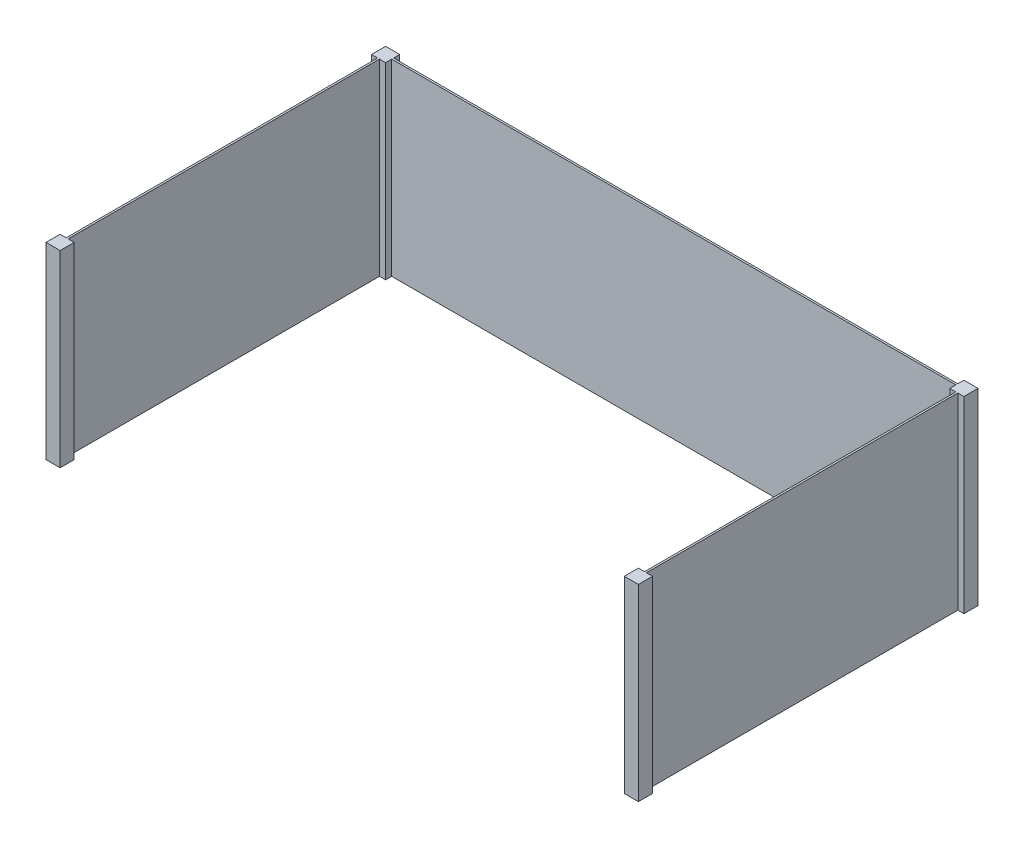
ISO-10303-21;
HEADER;
FILE_DESCRIPTION(('STEP AP214'),'2;1');
FILE_NAME('part.step','',(''),(''),'','','');
FILE_SCHEMA(('AUTOMOTIVE_DESIGN { 1 0 10303 214 1 1 1 1 }'));
ENDSEC;
DATA;
#1=APPLICATION_CONTEXT('core data for automotive mechanical design processes');
#2=APPLICATION_PROTOCOL_DEFINITION('international standard','automotive_design',2000,#1);
#3=PRODUCT_CONTEXT('',#1,'mechanical');
#4=PRODUCT('Part','Part','',(#3));
#5=PRODUCT_RELATED_PRODUCT_CATEGORY('part','',(#4));
#6=PRODUCT_DEFINITION_FORMATION('','',#4);
#7=PRODUCT_DEFINITION_CONTEXT('part definition',#1,'design');
#8=PRODUCT_DEFINITION('design','',#6,#7);
#9=PRODUCT_DEFINITION_SHAPE('','',#8);
#10=(LENGTH_UNIT() NAMED_UNIT(*) SI_UNIT(.MILLI.,.METRE.));
#11=(NAMED_UNIT(*) PLANE_ANGLE_UNIT() SI_UNIT($,.RADIAN.));
#12=(NAMED_UNIT(*) SI_UNIT($,.STERADIAN.) SOLID_ANGLE_UNIT());
#13=UNCERTAINTY_MEASURE_WITH_UNIT(LENGTH_MEASURE(1.E-05),#10,'distance_accuracy_value','');
#14=(GEOMETRIC_REPRESENTATION_CONTEXT(3) GLOBAL_UNCERTAINTY_ASSIGNED_CONTEXT((#13)) GLOBAL_UNIT_ASSIGNED_CONTEXT((#10,
#11,#12)) REPRESENTATION_CONTEXT('',''));
#15=CARTESIAN_POINT('',(0.,0.,0.));
#16=DIRECTION('',(0.,0.,1.));
#17=DIRECTION('',(1.,0.,0.));
#18=AXIS2_PLACEMENT_3D('',#15,#16,#17);
#19=CARTESIAN_POINT('',(37.5000000000001,1000.,5.));
#20=DIRECTION('',(-1.,0.,0.));
#21=DIRECTION('',(0.,0.,1.));
#22=AXIS2_PLACEMENT_3D('',#19,#20,#21);
#23=PLANE('',#22);
#24=DIRECTION('',(0.,0.,-1.));
#25=VECTOR('',#24,1.);
#26=CARTESIAN_POINT('',(37.5000000000001,0.,5.));
#27=LINE('',#26,#25);
#28=CARTESIAN_POINT('',(37.5,0.,37.5));
#29=VERTEX_POINT('',#28);
#30=CARTESIAN_POINT('',(37.5000000000001,0.,5.));
#31=VERTEX_POINT('',#30);
#32=EDGE_CURVE('E249',#29,#31,#27,.T.);
#33=ORIENTED_EDGE('',*,*,#32,.T.);
#34=DIRECTION('',(0.,-1.,0.));
#35=VECTOR('',#34,1.);
#36=CARTESIAN_POINT('',(37.5000000000001,1000.,5.));
#37=LINE('',#36,#35);
#38=CARTESIAN_POINT('',(37.5000000000001,1000.,5.));
#39=VERTEX_POINT('',#38);
#40=EDGE_CURVE('E11',#39,#31,#37,.T.);
#41=ORIENTED_EDGE('',*,*,#40,.F.);
#42=DIRECTION('',(0.,0.,-1.));
#43=VECTOR('',#42,1.);
#44=CARTESIAN_POINT('',(37.5000000000001,1000.,5.));
#45=LINE('',#44,#43);
#46=CARTESIAN_POINT('',(37.5,1000.,37.5));
#47=VERTEX_POINT('',#46);
#48=EDGE_CURVE('E303',#47,#39,#45,.T.);
#49=ORIENTED_EDGE('',*,*,#48,.F.);
#50=DIRECTION('',(0.,-1.,0.));
#51=VECTOR('',#50,1.);
#52=CARTESIAN_POINT('',(37.5,1000.,37.5));
#53=LINE('',#52,#51);
#54=EDGE_CURVE('E245',#47,#29,#53,.T.);
#55=ORIENTED_EDGE('',*,*,#54,.T.);
#56=EDGE_LOOP('',(#33,#41,#49,#55));
#57=FACE_BOUND('',#56,.T.);
#58=ADVANCED_FACE('F33',(#57),#23,.F.);
#59=CARTESIAN_POINT('',(3035.9725355,1000.,4.99999999999963));
#60=DIRECTION('',(0.,0.,-1.));
#61=DIRECTION('',(-1.,0.,0.));
#62=AXIS2_PLACEMENT_3D('',#59,#60,#61);
#63=PLANE('',#62);
#64=DIRECTION('',(1.,0.,0.));
#65=VECTOR('',#64,1.);
#66=CARTESIAN_POINT('',(3035.9725355,0.,4.99999999999963));
#67=LINE('',#66,#65);
#68=CARTESIAN_POINT('',(3035.9725355,0.,4.99999999999963));
#69=VERTEX_POINT('',#68);
#70=EDGE_CURVE('E252',#31,#69,#67,.T.);
#71=ORIENTED_EDGE('',*,*,#70,.T.);
#72=DIRECTION('',(0.,-1.,0.));
#73=VECTOR('',#72,1.);
#74=CARTESIAN_POINT('',(3035.9725355,1000.,4.99999999999963));
#75=LINE('',#74,#73);
#76=CARTESIAN_POINT('',(3035.9725355,1000.,4.99999999999963));
#77=VERTEX_POINT('',#76);
#78=EDGE_CURVE('E41',#77,#69,#75,.T.);
#79=ORIENTED_EDGE('',*,*,#78,.F.);
#80=DIRECTION('',(1.,0.,0.));
#81=VECTOR('',#80,1.);
#82=CARTESIAN_POINT('',(3035.9725355,1000.,4.99999999999963));
#83=LINE('',#82,#81);
#84=EDGE_CURVE('E152',#39,#77,#83,.T.);
#85=ORIENTED_EDGE('',*,*,#84,.F.);
#86=ORIENTED_EDGE('',*,*,#40,.T.);
#87=EDGE_LOOP('',(#71,#79,#85,#86));
#88=FACE_BOUND('',#87,.T.);
#89=ADVANCED_FACE('F461',(#88),#63,.F.);
#90=CARTESIAN_POINT('',(3035.9725355,1000.,4.99999999999963));
#91=DIRECTION('',(1.,0.,0.));
#92=DIRECTION('',(0.,0.,-1.));
#93=AXIS2_PLACEMENT_3D('',#90,#91,#92);
#94=PLANE('',#93);
#95=DIRECTION('',(0.,0.,1.));
#96=VECTOR('',#95,1.);
#97=CARTESIAN_POINT('',(3035.9725355,0.,4.99999999999963));
#98=LINE('',#97,#96);
#99=CARTESIAN_POINT('',(3035.9725355,0.,37.5));
#100=VERTEX_POINT('',#99);
#101=EDGE_CURVE('E254',#69,#100,#98,.T.);
#102=ORIENTED_EDGE('',*,*,#101,.T.);
#103=DIRECTION('',(0.,-1.,0.));
#104=VECTOR('',#103,1.);
#105=CARTESIAN_POINT('',(3035.9725355,1000.,37.5));
#106=LINE('',#105,#104);
#107=CARTESIAN_POINT('',(3035.9725355,1000.,37.5));
#108=VERTEX_POINT('',#107);
#109=EDGE_CURVE('E370',#108,#100,#106,.T.);
#110=ORIENTED_EDGE('',*,*,#109,.F.);
#111=DIRECTION('',(0.,0.,1.));
#112=VECTOR('',#111,1.);
#113=CARTESIAN_POINT('',(3035.9725355,1000.,4.99999999999963));
#114=LINE('',#113,#112);
#115=EDGE_CURVE('E378',#77,#108,#114,.T.);
#116=ORIENTED_EDGE('',*,*,#115,.F.);
#117=ORIENTED_EDGE('',*,*,#78,.T.);
#118=EDGE_LOOP('',(#102,#110,#116,#117));
#119=FACE_BOUND('',#118,.T.);
#120=ADVANCED_FACE('F376',(#119),#94,.F.);
#121=CARTESIAN_POINT('',(3035.9725355,1000.,37.5));
#122=DIRECTION('',(0.,0.,-1.));
#123=DIRECTION('',(-1.,0.,0.));
#124=AXIS2_PLACEMENT_3D('',#121,#122,#123);
#125=PLANE('',#124);
#126=DIRECTION('',(1.,0.,0.));
#127=VECTOR('',#126,1.);
#128=CARTESIAN_POINT('',(3035.9725355,0.,37.5));
#129=LINE('',#128,#127);
#130=CARTESIAN_POINT('',(3068.4725355,0.,37.5000000000001));
#131=VERTEX_POINT('',#130);
#132=EDGE_CURVE('E256',#100,#131,#129,.T.);
#133=ORIENTED_EDGE('',*,*,#132,.T.);
#134=DIRECTION('',(0.,-1.,0.));
#135=VECTOR('',#134,1.);
#136=CARTESIAN_POINT('',(3068.4725355,1000.,37.5000000000001));
#137=LINE('',#136,#135);
#138=CARTESIAN_POINT('',(3068.4725355,1000.,37.5000000000001));
#139=VERTEX_POINT('',#138);
#140=EDGE_CURVE('E367',#139,#131,#137,.T.);
#141=ORIENTED_EDGE('',*,*,#140,.F.);
#142=DIRECTION('',(1.,0.,0.));
#143=VECTOR('',#142,1.);
#144=CARTESIAN_POINT('',(3035.9725355,1000.,37.5));
#145=LINE('',#144,#143);
#146=EDGE_CURVE('E396',#108,#139,#145,.T.);
#147=ORIENTED_EDGE('',*,*,#146,.F.);
#148=ORIENTED_EDGE('',*,*,#109,.T.);
#149=EDGE_LOOP('',(#133,#141,#147,#148));
#150=FACE_BOUND('',#149,.T.);
#151=ADVANCED_FACE('F387',(#150),#125,.F.);
#152=CARTESIAN_POINT('',(3068.4725355,1000.,1692.39399355666));
#153=DIRECTION('',(1.,0.,0.));
#154=DIRECTION('',(0.,0.,-1.));
#155=AXIS2_PLACEMENT_3D('',#152,#153,#154);
#156=PLANE('',#155);
#157=DIRECTION('',(0.,0.,1.));
#158=VECTOR('',#157,1.);
#159=CARTESIAN_POINT('',(3068.4725355,0.,1692.39399355666));
#160=LINE('',#159,#158);
#161=CARTESIAN_POINT('',(3068.4725355,0.,1692.39399355666));
#162=VERTEX_POINT('',#161);
#163=EDGE_CURVE('E258',#131,#162,#160,.T.);
#164=ORIENTED_EDGE('',*,*,#163,.T.);
#165=DIRECTION('',(0.,-1.,0.));
#166=VECTOR('',#165,1.);
#167=CARTESIAN_POINT('',(3068.4725355,1000.,1692.39399355666));
#168=LINE('',#167,#166);
#169=CARTESIAN_POINT('',(3068.4725355,1000.,1692.39399355666));
#170=VERTEX_POINT('',#169);
#171=EDGE_CURVE('E364',#170,#162,#168,.T.);
#172=ORIENTED_EDGE('',*,*,#171,.F.);
#173=DIRECTION('',(0.,0.,1.));
#174=VECTOR('',#173,1.);
#175=CARTESIAN_POINT('',(3068.4725355,1000.,1692.39399355666));
#176=LINE('',#175,#174);
#177=EDGE_CURVE('E393',#139,#170,#176,.T.);
#178=ORIENTED_EDGE('',*,*,#177,.F.);
#179=ORIENTED_EDGE('',*,*,#140,.T.);
#180=EDGE_LOOP('',(#164,#172,#178,#179));
#181=FACE_BOUND('',#180,.T.);
#182=ADVANCED_FACE('F391',(#181),#156,.F.);
#183=CARTESIAN_POINT('',(3035.9725355,1000.,1692.39399355666));
#184=DIRECTION('',(0.,0.,1.));
#185=DIRECTION('',(1.,0.,0.));
#186=AXIS2_PLACEMENT_3D('',#183,#184,#185);
#187=PLANE('',#186);
#188=DIRECTION('',(-1.,0.,0.));
#189=VECTOR('',#188,1.);
#190=CARTESIAN_POINT('',(3035.9725355,0.,1692.39399355666));
#191=LINE('',#190,#189);
#192=CARTESIAN_POINT('',(3035.9725355,0.,1692.39399355666));
#193=VERTEX_POINT('',#192);
#194=EDGE_CURVE('E260',#162,#193,#191,.T.);
#195=ORIENTED_EDGE('',*,*,#194,.T.);
#196=DIRECTION('',(0.,-1.,0.));
#197=VECTOR('',#196,1.);
#198=CARTESIAN_POINT('',(3035.9725355,1000.,1692.39399355666));
#199=LINE('',#198,#197);
#200=CARTESIAN_POINT('',(3035.9725355,1000.,1692.39399355666));
#201=VERTEX_POINT('',#200);
#202=EDGE_CURVE('E361',#201,#193,#199,.T.);
#203=ORIENTED_EDGE('',*,*,#202,.F.);
#204=DIRECTION('',(-1.,0.,0.));
#205=VECTOR('',#204,1.);
#206=CARTESIAN_POINT('',(3035.9725355,1000.,1692.39399355666));
#207=LINE('',#206,#205);
#208=EDGE_CURVE('E395',#170,#201,#207,.T.);
#209=ORIENTED_EDGE('',*,*,#208,.F.);
#210=ORIENTED_EDGE('',*,*,#171,.T.);
#211=EDGE_LOOP('',(#195,#203,#209,#210));
#212=FACE_BOUND('',#211,.T.);
#213=ADVANCED_FACE('F474',(#212),#187,.F.);
#214=CARTESIAN_POINT('',(3035.9725355,1000.,1692.39399355666));
#215=DIRECTION('',(1.,0.,0.));
#216=DIRECTION('',(0.,0.,-1.));
#217=AXIS2_PLACEMENT_3D('',#214,#215,#216);
#218=PLANE('',#217);
#219=DIRECTION('',(0.,0.,1.));
#220=VECTOR('',#219,1.);
#221=CARTESIAN_POINT('',(3035.9725355,0.,1692.39399355666));
#222=LINE('',#221,#220);
#223=CARTESIAN_POINT('',(3035.9725355,0.,1767.39399355666));
#224=VERTEX_POINT('',#223);
#225=EDGE_CURVE('E262',#193,#224,#222,.T.);
#226=ORIENTED_EDGE('',*,*,#225,.T.);
#227=DIRECTION('',(0.,-1.,0.));
#228=VECTOR('',#227,1.);
#229=CARTESIAN_POINT('',(3035.9725355,1000.,1767.39399355666));
#230=LINE('',#229,#228);
#231=CARTESIAN_POINT('',(3035.9725355,1000.,1767.39399355666));
#232=VERTEX_POINT('',#231);
#233=EDGE_CURVE('E358',#232,#224,#230,.T.);
#234=ORIENTED_EDGE('',*,*,#233,.F.);
#235=DIRECTION('',(0.,0.,1.));
#236=VECTOR('',#235,1.);
#237=CARTESIAN_POINT('',(3035.9725355,1000.,1692.39399355666));
#238=LINE('',#237,#236);
#239=EDGE_CURVE('E398',#201,#232,#238,.T.);
#240=ORIENTED_EDGE('',*,*,#239,.F.);
#241=ORIENTED_EDGE('',*,*,#202,.T.);
#242=EDGE_LOOP('',(#226,#234,#240,#241));
#243=FACE_BOUND('',#242,.T.);
#244=ADVANCED_FACE('F477',(#243),#218,.F.);
#245=CARTESIAN_POINT('',(3035.9725355,1000.,1767.39399355666));
#246=DIRECTION('',(0.,0.,-1.));
#247=DIRECTION('',(-1.,0.,0.));
#248=AXIS2_PLACEMENT_3D('',#245,#246,#247);
#249=PLANE('',#248);
#250=DIRECTION('',(1.,0.,0.));
#251=VECTOR('',#250,1.);
#252=CARTESIAN_POINT('',(3035.9725355,0.,1767.39399355666));
#253=LINE('',#252,#251);
#254=CARTESIAN_POINT('',(3110.9725355,0.,1767.39399355666));
#255=VERTEX_POINT('',#254);
#256=EDGE_CURVE('E264',#224,#255,#253,.T.);
#257=ORIENTED_EDGE('',*,*,#256,.T.);
#258=DIRECTION('',(0.,-1.,0.));
#259=VECTOR('',#258,1.);
#260=CARTESIAN_POINT('',(3110.9725355,1000.,1767.39399355666));
#261=LINE('',#260,#259);
#262=CARTESIAN_POINT('',(3110.9725355,1000.,1767.39399355666));
#263=VERTEX_POINT('',#262);
#264=EDGE_CURVE('E355',#263,#255,#261,.T.);
#265=ORIENTED_EDGE('',*,*,#264,.F.);
#266=DIRECTION('',(1.,0.,0.));
#267=VECTOR('',#266,1.);
#268=CARTESIAN_POINT('',(3035.9725355,1000.,1767.39399355666));
#269=LINE('',#268,#267);
#270=EDGE_CURVE('E404',#232,#263,#269,.T.);
#271=ORIENTED_EDGE('',*,*,#270,.F.);
#272=ORIENTED_EDGE('',*,*,#233,.T.);
#273=EDGE_LOOP('',(#257,#265,#271,#272));
#274=FACE_BOUND('',#273,.T.);
#275=ADVANCED_FACE('F481',(#274),#249,.F.);
#276=CARTESIAN_POINT('',(3110.9725355,1000.,1692.39399355666));
#277=DIRECTION('',(-1.,0.,0.));
#278=DIRECTION('',(0.,0.,1.));
#279=AXIS2_PLACEMENT_3D('',#276,#277,#278);
#280=PLANE('',#279);
#281=DIRECTION('',(0.,0.,-1.));
#282=VECTOR('',#281,1.);
#283=CARTESIAN_POINT('',(3110.9725355,0.,1692.39399355666));
#284=LINE('',#283,#282);
#285=CARTESIAN_POINT('',(3110.9725355,0.,1692.39399355666));
#286=VERTEX_POINT('',#285);
#287=EDGE_CURVE('E266',#255,#286,#284,.T.);
#288=ORIENTED_EDGE('',*,*,#287,.T.);
#289=DIRECTION('',(0.,-1.,0.));
#290=VECTOR('',#289,1.);
#291=CARTESIAN_POINT('',(3110.9725355,1000.,1692.39399355666));
#292=LINE('',#291,#290);
#293=CARTESIAN_POINT('',(3110.9725355,1000.,1692.39399355666));
#294=VERTEX_POINT('',#293);
#295=EDGE_CURVE('E352',#294,#286,#292,.T.);
#296=ORIENTED_EDGE('',*,*,#295,.F.);
#297=DIRECTION('',(0.,0.,-1.));
#298=VECTOR('',#297,1.);
#299=CARTESIAN_POINT('',(3110.9725355,1000.,1692.39399355666));
#300=LINE('',#299,#298);
#301=EDGE_CURVE('E406',#263,#294,#300,.T.);
#302=ORIENTED_EDGE('',*,*,#301,.F.);
#303=ORIENTED_EDGE('',*,*,#264,.T.);
#304=EDGE_LOOP('',(#288,#296,#302,#303));
#305=FACE_BOUND('',#304,.T.);
#306=ADVANCED_FACE('F485',(#305),#280,.F.);
#307=CARTESIAN_POINT('',(3078.4725355,1000.,1692.39399355666));
#308=DIRECTION('',(0.,0.,1.));
#309=DIRECTION('',(1.,0.,0.));
#310=AXIS2_PLACEMENT_3D('',#307,#308,#309);
#311=PLANE('',#310);
#312=DIRECTION('',(-1.,0.,0.));
#313=VECTOR('',#312,1.);
#314=CARTESIAN_POINT('',(3078.4725355,0.,1692.39399355666));
#315=LINE('',#314,#313);
#316=CARTESIAN_POINT('',(3078.4725355,0.,1692.39399355666));
#317=VERTEX_POINT('',#316);
#318=EDGE_CURVE('E268',#286,#317,#315,.T.);
#319=ORIENTED_EDGE('',*,*,#318,.T.);
#320=DIRECTION('',(0.,-1.,0.));
#321=VECTOR('',#320,1.);
#322=CARTESIAN_POINT('',(3078.4725355,1000.,1692.39399355666));
#323=LINE('',#322,#321);
#324=CARTESIAN_POINT('',(3078.4725355,1000.,1692.39399355666));
#325=VERTEX_POINT('',#324);
#326=EDGE_CURVE('E349',#325,#317,#323,.T.);
#327=ORIENTED_EDGE('',*,*,#326,.F.);
#328=DIRECTION('',(-1.,0.,0.));
#329=VECTOR('',#328,1.);
#330=CARTESIAN_POINT('',(3078.4725355,1000.,1692.39399355666));
#331=LINE('',#330,#329);
#332=EDGE_CURVE('E408',#294,#325,#331,.T.);
#333=ORIENTED_EDGE('',*,*,#332,.F.);
#334=ORIENTED_EDGE('',*,*,#295,.T.);
#335=EDGE_LOOP('',(#319,#327,#333,#334));
#336=FACE_BOUND('',#335,.T.);
#337=ADVANCED_FACE('F489',(#336),#311,.F.);
#338=CARTESIAN_POINT('',(3078.4725355,1000.,37.5000000000001));
#339=DIRECTION('',(-1.,0.,0.));
#340=DIRECTION('',(0.,0.,1.));
#341=AXIS2_PLACEMENT_3D('',#338,#339,#340);
#342=PLANE('',#341);
#343=DIRECTION('',(0.,0.,-1.));
#344=VECTOR('',#343,1.);
#345=CARTESIAN_POINT('',(3078.4725355,0.,37.5000000000001));
#346=LINE('',#345,#344);
#347=CARTESIAN_POINT('',(3078.4725355,0.,37.5000000000001));
#348=VERTEX_POINT('',#347);
#349=EDGE_CURVE('E270',#317,#348,#346,.T.);
#350=ORIENTED_EDGE('',*,*,#349,.T.);
#351=DIRECTION('',(0.,-1.,0.));
#352=VECTOR('',#351,1.);
#353=CARTESIAN_POINT('',(3078.4725355,1000.,37.5000000000001));
#354=LINE('',#353,#352);
#355=CARTESIAN_POINT('',(3078.4725355,1000.,37.5000000000001));
#356=VERTEX_POINT('',#355);
#357=EDGE_CURVE('E346',#356,#348,#354,.T.);
#358=ORIENTED_EDGE('',*,*,#357,.F.);
#359=DIRECTION('',(0.,0.,-1.));
#360=VECTOR('',#359,1.);
#361=CARTESIAN_POINT('',(3078.4725355,1000.,37.5000000000001));
#362=LINE('',#361,#360);
#363=EDGE_CURVE('E410',#325,#356,#362,.T.);
#364=ORIENTED_EDGE('',*,*,#363,.F.);
#365=ORIENTED_EDGE('',*,*,#326,.T.);
#366=EDGE_LOOP('',(#350,#358,#364,#365));
#367=FACE_BOUND('',#366,.T.);
#368=ADVANCED_FACE('F493',(#367),#342,.F.);
#369=CARTESIAN_POINT('',(3078.4725355,1000.,37.5000000000001));
#370=DIRECTION('',(0.,0.,-1.));
#371=DIRECTION('',(-1.,0.,0.));
#372=AXIS2_PLACEMENT_3D('',#369,#370,#371);
#373=PLANE('',#372);
#374=DIRECTION('',(1.,0.,0.));
#375=VECTOR('',#374,1.);
#376=CARTESIAN_POINT('',(3078.4725355,0.,37.5000000000001));
#377=LINE('',#376,#375);
#378=CARTESIAN_POINT('',(3110.9725355,0.,37.5));
#379=VERTEX_POINT('',#378);
#380=EDGE_CURVE('E272',#348,#379,#377,.T.);
#381=ORIENTED_EDGE('',*,*,#380,.T.);
#382=DIRECTION('',(0.,-1.,0.));
#383=VECTOR('',#382,1.);
#384=CARTESIAN_POINT('',(3110.9725355,1000.,37.5));
#385=LINE('',#384,#383);
#386=CARTESIAN_POINT('',(3110.9725355,1000.,37.5));
#387=VERTEX_POINT('',#386);
#388=EDGE_CURVE('E343',#387,#379,#385,.T.);
#389=ORIENTED_EDGE('',*,*,#388,.F.);
#390=DIRECTION('',(1.,0.,0.));
#391=VECTOR('',#390,1.);
#392=CARTESIAN_POINT('',(3078.4725355,1000.,37.5000000000001));
#393=LINE('',#392,#391);
#394=EDGE_CURVE('E412',#356,#387,#393,.T.);
#395=ORIENTED_EDGE('',*,*,#394,.F.);
#396=ORIENTED_EDGE('',*,*,#357,.T.);
#397=EDGE_LOOP('',(#381,#389,#395,#396));
#398=FACE_BOUND('',#397,.T.);
#399=ADVANCED_FACE('F497',(#398),#373,.F.);
#400=CARTESIAN_POINT('',(3110.9725355,1000.,-37.5));
#401=DIRECTION('',(-1.,0.,0.));
#402=DIRECTION('',(0.,0.,1.));
#403=AXIS2_PLACEMENT_3D('',#400,#401,#402);
#404=PLANE('',#403);
#405=DIRECTION('',(0.,0.,-1.));
#406=VECTOR('',#405,1.);
#407=CARTESIAN_POINT('',(3110.9725355,0.,-37.5));
#408=LINE('',#407,#406);
#409=CARTESIAN_POINT('',(3110.9725355,0.,-37.5));
#410=VERTEX_POINT('',#409);
#411=EDGE_CURVE('E274',#379,#410,#408,.T.);
#412=ORIENTED_EDGE('',*,*,#411,.T.);
#413=DIRECTION('',(0.,-1.,0.));
#414=VECTOR('',#413,1.);
#415=CARTESIAN_POINT('',(3110.9725355,1000.,-37.5));
#416=LINE('',#415,#414);
#417=CARTESIAN_POINT('',(3110.9725355,1000.,-37.5));
#418=VERTEX_POINT('',#417);
#419=EDGE_CURVE('E340',#418,#410,#416,.T.);
#420=ORIENTED_EDGE('',*,*,#419,.F.);
#421=DIRECTION('',(0.,0.,-1.));
#422=VECTOR('',#421,1.);
#423=CARTESIAN_POINT('',(3110.9725355,1000.,-37.5));
#424=LINE('',#423,#422);
#425=EDGE_CURVE('E414',#387,#418,#424,.T.);
#426=ORIENTED_EDGE('',*,*,#425,.F.);
#427=ORIENTED_EDGE('',*,*,#388,.T.);
#428=EDGE_LOOP('',(#412,#420,#426,#427));
#429=FACE_BOUND('',#428,.T.);
#430=ADVANCED_FACE('F501',(#429),#404,.F.);
#431=CARTESIAN_POINT('',(3035.9725355,1000.,-37.5));
#432=DIRECTION('',(0.,0.,1.));
#433=DIRECTION('',(1.,0.,0.));
#434=AXIS2_PLACEMENT_3D('',#431,#432,#433);
#435=PLANE('',#434);
#436=DIRECTION('',(-1.,0.,0.));
#437=VECTOR('',#436,1.);
#438=CARTESIAN_POINT('',(3035.9725355,0.,-37.5));
#439=LINE('',#438,#437);
#440=CARTESIAN_POINT('',(3035.9725355,0.,-37.5));
#441=VERTEX_POINT('',#440);
#442=EDGE_CURVE('E276',#410,#441,#439,.T.);
#443=ORIENTED_EDGE('',*,*,#442,.T.);
#444=DIRECTION('',(0.,-1.,0.));
#445=VECTOR('',#444,1.);
#446=CARTESIAN_POINT('',(3035.9725355,1000.,-37.5));
#447=LINE('',#446,#445);
#448=CARTESIAN_POINT('',(3035.9725355,1000.,-37.5));
#449=VERTEX_POINT('',#448);
#450=EDGE_CURVE('E337',#449,#441,#447,.T.);
#451=ORIENTED_EDGE('',*,*,#450,.F.);
#452=DIRECTION('',(-1.,0.,0.));
#453=VECTOR('',#452,1.);
#454=CARTESIAN_POINT('',(3035.9725355,1000.,-37.5));
#455=LINE('',#454,#453);
#456=EDGE_CURVE('E416',#418,#449,#455,.T.);
#457=ORIENTED_EDGE('',*,*,#456,.F.);
#458=ORIENTED_EDGE('',*,*,#419,.T.);
#459=EDGE_LOOP('',(#443,#451,#457,#458));
#460=FACE_BOUND('',#459,.T.);
#461=ADVANCED_FACE('F505',(#460),#435,.F.);
#462=CARTESIAN_POINT('',(3035.9725355,1000.,-37.5));
#463=DIRECTION('',(1.,0.,0.));
#464=DIRECTION('',(0.,0.,-1.));
#465=AXIS2_PLACEMENT_3D('',#462,#463,#464);
#466=PLANE('',#465);
#467=DIRECTION('',(0.,0.,1.));
#468=VECTOR('',#467,1.);
#469=CARTESIAN_POINT('',(3035.9725355,0.,-37.5));
#470=LINE('',#469,#468);
#471=CARTESIAN_POINT('',(3035.9725355,0.,-5.));
#472=VERTEX_POINT('',#471);
#473=EDGE_CURVE('E278',#441,#472,#470,.T.);
#474=ORIENTED_EDGE('',*,*,#473,.T.);
#475=DIRECTION('',(0.,-1.,0.));
#476=VECTOR('',#475,1.);
#477=CARTESIAN_POINT('',(3035.9725355,1000.,-5.));
#478=LINE('',#477,#476);
#479=CARTESIAN_POINT('',(3035.9725355,1000.,-5.));
#480=VERTEX_POINT('',#479);
#481=EDGE_CURVE('E334',#480,#472,#478,.T.);
#482=ORIENTED_EDGE('',*,*,#481,.F.);
#483=DIRECTION('',(0.,0.,1.));
#484=VECTOR('',#483,1.);
#485=CARTESIAN_POINT('',(3035.9725355,1000.,-37.5));
#486=LINE('',#485,#484);
#487=EDGE_CURVE('E418',#449,#480,#486,.T.);
#488=ORIENTED_EDGE('',*,*,#487,.F.);
#489=ORIENTED_EDGE('',*,*,#450,.T.);
#490=EDGE_LOOP('',(#474,#482,#488,#489));
#491=FACE_BOUND('',#490,.T.);
#492=ADVANCED_FACE('F509',(#491),#466,.F.);
#493=CARTESIAN_POINT('',(37.5,1000.,-5.));
#494=DIRECTION('',(0.,0.,1.));
#495=DIRECTION('',(1.,0.,0.));
#496=AXIS2_PLACEMENT_3D('',#493,#494,#495);
#497=PLANE('',#496);
#498=DIRECTION('',(-1.,0.,0.));
#499=VECTOR('',#498,1.);
#500=CARTESIAN_POINT('',(37.5,0.,-5.));
#501=LINE('',#500,#499);
#502=CARTESIAN_POINT('',(37.5,0.,-5.));
#503=VERTEX_POINT('',#502);
#504=EDGE_CURVE('E280',#472,#503,#501,.T.);
#505=ORIENTED_EDGE('',*,*,#504,.T.);
#506=DIRECTION('',(0.,-1.,0.));
#507=VECTOR('',#506,1.);
#508=CARTESIAN_POINT('',(37.5,1000.,-5.));
#509=LINE('',#508,#507);
#510=CARTESIAN_POINT('',(37.5,1000.,-5.));
#511=VERTEX_POINT('',#510);
#512=EDGE_CURVE('E331',#511,#503,#509,.T.);
#513=ORIENTED_EDGE('',*,*,#512,.F.);
#514=DIRECTION('',(-1.,0.,0.));
#515=VECTOR('',#514,1.);
#516=CARTESIAN_POINT('',(37.5,1000.,-5.));
#517=LINE('',#516,#515);
#518=EDGE_CURVE('E420',#480,#511,#517,.T.);
#519=ORIENTED_EDGE('',*,*,#518,.F.);
#520=ORIENTED_EDGE('',*,*,#481,.T.);
#521=EDGE_LOOP('',(#505,#513,#519,#520));
#522=FACE_BOUND('',#521,.T.);
#523=ADVANCED_FACE('F513',(#522),#497,.F.);
#524=CARTESIAN_POINT('',(37.5,1000.,-37.5));
#525=DIRECTION('',(-1.,0.,0.));
#526=DIRECTION('',(0.,0.,1.));
#527=AXIS2_PLACEMENT_3D('',#524,#525,#526);
#528=PLANE('',#527);
#529=DIRECTION('',(0.,0.,-1.));
#530=VECTOR('',#529,1.);
#531=CARTESIAN_POINT('',(37.5,0.,-37.5));
#532=LINE('',#531,#530);
#533=CARTESIAN_POINT('',(37.5,0.,-37.5));
#534=VERTEX_POINT('',#533);
#535=EDGE_CURVE('E282',#503,#534,#532,.T.);
#536=ORIENTED_EDGE('',*,*,#535,.T.);
#537=DIRECTION('',(0.,-1.,0.));
#538=VECTOR('',#537,1.);
#539=CARTESIAN_POINT('',(37.5,1000.,-37.5));
#540=LINE('',#539,#538);
#541=CARTESIAN_POINT('',(37.5,1000.,-37.5));
#542=VERTEX_POINT('',#541);
#543=EDGE_CURVE('E328',#542,#534,#540,.T.);
#544=ORIENTED_EDGE('',*,*,#543,.F.);
#545=DIRECTION('',(0.,0.,-1.));
#546=VECTOR('',#545,1.);
#547=CARTESIAN_POINT('',(37.5,1000.,-37.5));
#548=LINE('',#547,#546);
#549=EDGE_CURVE('E422',#511,#542,#548,.T.);
#550=ORIENTED_EDGE('',*,*,#549,.F.);
#551=ORIENTED_EDGE('',*,*,#512,.T.);
#552=EDGE_LOOP('',(#536,#544,#550,#551));
#553=FACE_BOUND('',#552,.T.);
#554=ADVANCED_FACE('F517',(#553),#528,.F.);
#555=CARTESIAN_POINT('',(-37.5,1000.,-37.5));
#556=DIRECTION('',(0.,0.,1.));
#557=DIRECTION('',(1.,0.,0.));
#558=AXIS2_PLACEMENT_3D('',#555,#556,#557);
#559=PLANE('',#558);
#560=DIRECTION('',(-1.,0.,0.));
#561=VECTOR('',#560,1.);
#562=CARTESIAN_POINT('',(-37.5,0.,-37.5));
#563=LINE('',#562,#561);
#564=CARTESIAN_POINT('',(-37.5,0.,-37.5));
#565=VERTEX_POINT('',#564);
#566=EDGE_CURVE('E284',#534,#565,#563,.T.);
#567=ORIENTED_EDGE('',*,*,#566,.T.);
#568=DIRECTION('',(0.,-1.,0.));
#569=VECTOR('',#568,1.);
#570=CARTESIAN_POINT('',(-37.5,1000.,-37.5));
#571=LINE('',#570,#569);
#572=CARTESIAN_POINT('',(-37.5,1000.,-37.5));
#573=VERTEX_POINT('',#572);
#574=EDGE_CURVE('E325',#573,#565,#571,.T.);
#575=ORIENTED_EDGE('',*,*,#574,.F.);
#576=DIRECTION('',(-1.,0.,0.));
#577=VECTOR('',#576,1.);
#578=CARTESIAN_POINT('',(-37.5,1000.,-37.5));
#579=LINE('',#578,#577);
#580=EDGE_CURVE('E424',#542,#573,#579,.T.);
#581=ORIENTED_EDGE('',*,*,#580,.F.);
#582=ORIENTED_EDGE('',*,*,#543,.T.);
#583=EDGE_LOOP('',(#567,#575,#581,#582));
#584=FACE_BOUND('',#583,.T.);
#585=ADVANCED_FACE('F521',(#584),#559,.F.);
#586=CARTESIAN_POINT('',(-37.5,1000.,-37.5));
#587=DIRECTION('',(1.,0.,0.));
#588=DIRECTION('',(0.,0.,-1.));
#589=AXIS2_PLACEMENT_3D('',#586,#587,#588);
#590=PLANE('',#589);
#591=DIRECTION('',(0.,0.,1.));
#592=VECTOR('',#591,1.);
#593=CARTESIAN_POINT('',(-37.5,0.,-37.5));
#594=LINE('',#593,#592);
#595=CARTESIAN_POINT('',(-37.5,0.,37.5));
#596=VERTEX_POINT('',#595);
#597=EDGE_CURVE('E286',#565,#596,#594,.T.);
#598=ORIENTED_EDGE('',*,*,#597,.T.);
#599=DIRECTION('',(0.,-1.,0.));
#600=VECTOR('',#599,1.);
#601=CARTESIAN_POINT('',(-37.5,1000.,37.5));
#602=LINE('',#601,#600);
#603=CARTESIAN_POINT('',(-37.5,1000.,37.5));
#604=VERTEX_POINT('',#603);
#605=EDGE_CURVE('E322',#604,#596,#602,.T.);
#606=ORIENTED_EDGE('',*,*,#605,.F.);
#607=DIRECTION('',(0.,0.,1.));
#608=VECTOR('',#607,1.);
#609=CARTESIAN_POINT('',(-37.5,1000.,-37.5));
#610=LINE('',#609,#608);
#611=EDGE_CURVE('E426',#573,#604,#610,.T.);
#612=ORIENTED_EDGE('',*,*,#611,.F.);
#613=ORIENTED_EDGE('',*,*,#574,.T.);
#614=EDGE_LOOP('',(#598,#606,#612,#613));
#615=FACE_BOUND('',#614,.T.);
#616=ADVANCED_FACE('F525',(#615),#590,.F.);
#617=CARTESIAN_POINT('',(-37.5,1000.,37.5));
#618=DIRECTION('',(0.,0.,-1.));
#619=DIRECTION('',(-1.,0.,0.));
#620=AXIS2_PLACEMENT_3D('',#617,#618,#619);
#621=PLANE('',#620);
#622=DIRECTION('',(1.,0.,0.));
#623=VECTOR('',#622,1.);
#624=CARTESIAN_POINT('',(-37.5,0.,37.5));
#625=LINE('',#624,#623);
#626=CARTESIAN_POINT('',(-5.,0.,37.5));
#627=VERTEX_POINT('',#626);
#628=EDGE_CURVE('E288',#596,#627,#625,.T.);
#629=ORIENTED_EDGE('',*,*,#628,.T.);
#630=DIRECTION('',(0.,-1.,0.));
#631=VECTOR('',#630,1.);
#632=CARTESIAN_POINT('',(-5.,1000.,37.5));
#633=LINE('',#632,#631);
#634=CARTESIAN_POINT('',(-5.,1000.,37.5));
#635=VERTEX_POINT('',#634);
#636=EDGE_CURVE('E319',#635,#627,#633,.T.);
#637=ORIENTED_EDGE('',*,*,#636,.F.);
#638=DIRECTION('',(1.,0.,0.));
#639=VECTOR('',#638,1.);
#640=CARTESIAN_POINT('',(-37.5,1000.,37.5));
#641=LINE('',#640,#639);
#642=EDGE_CURVE('E428',#604,#635,#641,.T.);
#643=ORIENTED_EDGE('',*,*,#642,.F.);
#644=ORIENTED_EDGE('',*,*,#605,.T.);
#645=EDGE_LOOP('',(#629,#637,#643,#644));
#646=FACE_BOUND('',#645,.T.);
#647=ADVANCED_FACE('F529',(#646),#621,.F.);
#648=CARTESIAN_POINT('',(-5.,1000.,37.5));
#649=DIRECTION('',(1.,0.,0.));
#650=DIRECTION('',(0.,0.,-1.));
#651=AXIS2_PLACEMENT_3D('',#648,#649,#650);
#652=PLANE('',#651);
#653=DIRECTION('',(0.,0.,1.));
#654=VECTOR('',#653,1.);
#655=CARTESIAN_POINT('',(-5.,0.,37.5));
#656=LINE('',#655,#654);
#657=CARTESIAN_POINT('',(-4.9999999999998,0.,1692.39399355666));
#658=VERTEX_POINT('',#657);
#659=EDGE_CURVE('E290',#627,#658,#656,.T.);
#660=ORIENTED_EDGE('',*,*,#659,.T.);
#661=DIRECTION('',(0.,-1.,0.));
#662=VECTOR('',#661,1.);
#663=CARTESIAN_POINT('',(-4.9999999999998,1000.,1692.39399355666));
#664=LINE('',#663,#662);
#665=CARTESIAN_POINT('',(-4.9999999999998,1000.,1692.39399355666));
#666=VERTEX_POINT('',#665);
#667=EDGE_CURVE('E316',#666,#658,#664,.T.);
#668=ORIENTED_EDGE('',*,*,#667,.F.);
#669=DIRECTION('',(0.,0.,1.));
#670=VECTOR('',#669,1.);
#671=CARTESIAN_POINT('',(-5.,1000.,37.5));
#672=LINE('',#671,#670);
#673=EDGE_CURVE('E430',#635,#666,#672,.T.);
#674=ORIENTED_EDGE('',*,*,#673,.F.);
#675=ORIENTED_EDGE('',*,*,#636,.T.);
#676=EDGE_LOOP('',(#660,#668,#674,#675));
#677=FACE_BOUND('',#676,.T.);
#678=ADVANCED_FACE('F533',(#677),#652,.F.);
#679=CARTESIAN_POINT('',(-37.4999999999819,1000.,1692.39399355667));
#680=DIRECTION('',(0.,0.,1.));
#681=DIRECTION('',(1.,0.,0.));
#682=AXIS2_PLACEMENT_3D('',#679,#680,#681);
#683=PLANE('',#682);
#684=DIRECTION('',(-1.,0.,0.));
#685=VECTOR('',#684,1.);
#686=CARTESIAN_POINT('',(-37.4999999999819,0.,1692.39399355667));
#687=LINE('',#686,#685);
#688=CARTESIAN_POINT('',(-37.4999999999819,0.,1692.39399355667));
#689=VERTEX_POINT('',#688);
#690=EDGE_CURVE('E292',#658,#689,#687,.T.);
#691=ORIENTED_EDGE('',*,*,#690,.T.);
#692=DIRECTION('',(0.,-1.,0.));
#693=VECTOR('',#692,1.);
#694=CARTESIAN_POINT('',(-37.4999999999819,1000.,1692.39399355667));
#695=LINE('',#694,#693);
#696=CARTESIAN_POINT('',(-37.4999999999819,1000.,1692.39399355667));
#697=VERTEX_POINT('',#696);
#698=EDGE_CURVE('E313',#697,#689,#695,.T.);
#699=ORIENTED_EDGE('',*,*,#698,.F.);
#700=DIRECTION('',(-1.,0.,0.));
#701=VECTOR('',#700,1.);
#702=CARTESIAN_POINT('',(-37.4999999999819,1000.,1692.39399355667));
#703=LINE('',#702,#701);
#704=EDGE_CURVE('E432',#666,#697,#703,.T.);
#705=ORIENTED_EDGE('',*,*,#704,.F.);
#706=ORIENTED_EDGE('',*,*,#667,.T.);
#707=EDGE_LOOP('',(#691,#699,#705,#706));
#708=FACE_BOUND('',#707,.T.);
#709=ADVANCED_FACE('F537',(#708),#683,.F.);
#710=CARTESIAN_POINT('',(-37.4999999999819,1000.,1692.39399355667));
#711=DIRECTION('',(1.,0.,0.));
#712=DIRECTION('',(0.,0.,-1.));
#713=AXIS2_PLACEMENT_3D('',#710,#711,#712);
#714=PLANE('',#713);
#715=DIRECTION('',(0.,0.,1.));
#716=VECTOR('',#715,1.);
#717=CARTESIAN_POINT('',(-37.4999999999819,0.,1692.39399355667));
#718=LINE('',#717,#716);
#719=CARTESIAN_POINT('',(-37.4999999999819,0.,1767.39399355666));
#720=VERTEX_POINT('',#719);
#721=EDGE_CURVE('E294',#689,#720,#718,.T.);
#722=ORIENTED_EDGE('',*,*,#721,.T.);
#723=DIRECTION('',(0.,-1.,0.));
#724=VECTOR('',#723,1.);
#725=CARTESIAN_POINT('',(-37.4999999999819,1000.,1767.39399355666));
#726=LINE('',#725,#724);
#727=CARTESIAN_POINT('',(-37.4999999999819,1000.,1767.39399355666));
#728=VERTEX_POINT('',#727);
#729=EDGE_CURVE('E310',#728,#720,#726,.T.);
#730=ORIENTED_EDGE('',*,*,#729,.F.);
#731=DIRECTION('',(0.,0.,1.));
#732=VECTOR('',#731,1.);
#733=CARTESIAN_POINT('',(-37.4999999999819,1000.,1692.39399355667));
#734=LINE('',#733,#732);
#735=EDGE_CURVE('E434',#697,#728,#734,.T.);
#736=ORIENTED_EDGE('',*,*,#735,.F.);
#737=ORIENTED_EDGE('',*,*,#698,.T.);
#738=EDGE_LOOP('',(#722,#730,#736,#737));
#739=FACE_BOUND('',#738,.T.);
#740=ADVANCED_FACE('F541',(#739),#714,.F.);
#741=CARTESIAN_POINT('',(-37.4999999999819,1000.,1767.39399355666));
#742=DIRECTION('',(0.,0.,-1.));
#743=DIRECTION('',(-1.,0.,0.));
#744=AXIS2_PLACEMENT_3D('',#741,#742,#743);
#745=PLANE('',#744);
#746=DIRECTION('',(1.,0.,0.));
#747=VECTOR('',#746,1.);
#748=CARTESIAN_POINT('',(-37.4999999999819,0.,1767.39399355666));
#749=LINE('',#748,#747);
#750=CARTESIAN_POINT('',(37.5000000000181,0.,1767.39399355666));
#751=VERTEX_POINT('',#750);
#752=EDGE_CURVE('E296',#720,#751,#749,.T.);
#753=ORIENTED_EDGE('',*,*,#752,.T.);
#754=DIRECTION('',(0.,-1.,0.));
#755=VECTOR('',#754,1.);
#756=CARTESIAN_POINT('',(37.5000000000181,1000.,1767.39399355666));
#757=LINE('',#756,#755);
#758=CARTESIAN_POINT('',(37.5000000000181,1000.,1767.39399355666));
#759=VERTEX_POINT('',#758);
#760=EDGE_CURVE('E307',#759,#751,#757,.T.);
#761=ORIENTED_EDGE('',*,*,#760,.F.);
#762=DIRECTION('',(1.,0.,0.));
#763=VECTOR('',#762,1.);
#764=CARTESIAN_POINT('',(-37.4999999999819,1000.,1767.39399355666));
#765=LINE('',#764,#763);
#766=EDGE_CURVE('E436',#728,#759,#765,.T.);
#767=ORIENTED_EDGE('',*,*,#766,.F.);
#768=ORIENTED_EDGE('',*,*,#729,.T.);
#769=EDGE_LOOP('',(#753,#761,#767,#768));
#770=FACE_BOUND('',#769,.T.);
#771=ADVANCED_FACE('F442',(#770),#745,.F.);
#772=CARTESIAN_POINT('',(37.5000000000181,1000.,1692.39399355666));
#773=DIRECTION('',(-1.,0.,0.));
#774=DIRECTION('',(0.,0.,1.));
#775=AXIS2_PLACEMENT_3D('',#772,#773,#774);
#776=PLANE('',#775);
#777=DIRECTION('',(0.,0.,-1.));
#778=VECTOR('',#777,1.);
#779=CARTESIAN_POINT('',(37.5000000000181,0.,1692.39399355666));
#780=LINE('',#779,#778);
#781=CARTESIAN_POINT('',(37.5000000000181,0.,1692.39399355666));
#782=VERTEX_POINT('',#781);
#783=EDGE_CURVE('E298',#751,#782,#780,.T.);
#784=ORIENTED_EDGE('',*,*,#783,.T.);
#785=DIRECTION('',(0.,-1.,0.));
#786=VECTOR('',#785,1.);
#787=CARTESIAN_POINT('',(37.5000000000181,1000.,1692.39399355666));
#788=LINE('',#787,#786);
#789=CARTESIAN_POINT('',(37.5000000000181,1000.,1692.39399355666));
#790=VERTEX_POINT('',#789);
#791=EDGE_CURVE('E240',#790,#782,#788,.T.);
#792=ORIENTED_EDGE('',*,*,#791,.F.);
#793=DIRECTION('',(0.,0.,-1.));
#794=VECTOR('',#793,1.);
#795=CARTESIAN_POINT('',(37.5000000000181,1000.,1692.39399355666));
#796=LINE('',#795,#794);
#797=EDGE_CURVE('E231',#759,#790,#796,.T.);
#798=ORIENTED_EDGE('',*,*,#797,.F.);
#799=ORIENTED_EDGE('',*,*,#760,.T.);
#800=EDGE_LOOP('',(#784,#792,#798,#799));
#801=FACE_BOUND('',#800,.T.);
#802=ADVANCED_FACE('F446',(#801),#776,.F.);
#803=CARTESIAN_POINT('',(5.,1000.,1692.39399355666));
#804=DIRECTION('',(0.,0.,1.));
#805=DIRECTION('',(1.,0.,0.));
#806=AXIS2_PLACEMENT_3D('',#803,#804,#805);
#807=PLANE('',#806);
#808=DIRECTION('',(-1.,0.,0.));
#809=VECTOR('',#808,1.);
#810=CARTESIAN_POINT('',(5.,0.,1692.39399355666));
#811=LINE('',#810,#809);
#812=CARTESIAN_POINT('',(5.,0.,1692.39399355666));
#813=VERTEX_POINT('',#812);
#814=EDGE_CURVE('E239',#782,#813,#811,.T.);
#815=ORIENTED_EDGE('',*,*,#814,.T.);
#816=DIRECTION('',(0.,-1.,0.));
#817=VECTOR('',#816,1.);
#818=CARTESIAN_POINT('',(5.,1000.,1692.39399355666));
#819=LINE('',#818,#817);
#820=CARTESIAN_POINT('',(5.,1000.,1692.39399355666));
#821=VERTEX_POINT('',#820);
#822=EDGE_CURVE('E236',#821,#813,#819,.T.);
#823=ORIENTED_EDGE('',*,*,#822,.F.);
#824=DIRECTION('',(-1.,0.,0.));
#825=VECTOR('',#824,1.);
#826=CARTESIAN_POINT('',(5.,1000.,1692.39399355666));
#827=LINE('',#826,#825);
#828=EDGE_CURVE('E225',#790,#821,#827,.T.);
#829=ORIENTED_EDGE('',*,*,#828,.F.);
#830=ORIENTED_EDGE('',*,*,#791,.T.);
#831=EDGE_LOOP('',(#815,#823,#829,#830));
#832=FACE_BOUND('',#831,.T.);
#833=ADVANCED_FACE('F237',(#832),#807,.F.);
#834=CARTESIAN_POINT('',(5.,1000.,1692.39399355666));
#835=DIRECTION('',(-1.,0.,0.));
#836=DIRECTION('',(0.,0.,1.));
#837=AXIS2_PLACEMENT_3D('',#834,#835,#836);
#838=PLANE('',#837);
#839=DIRECTION('',(0.,0.,-1.));
#840=VECTOR('',#839,1.);
#841=CARTESIAN_POINT('',(5.,0.,1692.39399355666));
#842=LINE('',#841,#840);
#843=CARTESIAN_POINT('',(5.,0.,37.5000000000001));
#844=VERTEX_POINT('',#843);
#845=EDGE_CURVE('E138',#813,#844,#842,.T.);
#846=ORIENTED_EDGE('',*,*,#845,.T.);
#847=DIRECTION('',(0.,-1.,0.));
#848=VECTOR('',#847,1.);
#849=CARTESIAN_POINT('',(5.,1000.,37.5000000000001));
#850=LINE('',#849,#848);
#851=CARTESIAN_POINT('',(5.,1000.,37.5000000000001));
#852=VERTEX_POINT('',#851);
#853=EDGE_CURVE('E241',#852,#844,#850,.T.);
#854=ORIENTED_EDGE('',*,*,#853,.F.);
#855=DIRECTION('',(0.,0.,-1.));
#856=VECTOR('',#855,1.);
#857=CARTESIAN_POINT('',(5.,1000.,1692.39399355666));
#858=LINE('',#857,#856);
#859=EDGE_CURVE('E229',#821,#852,#858,.T.);
#860=ORIENTED_EDGE('',*,*,#859,.F.);
#861=ORIENTED_EDGE('',*,*,#822,.T.);
#862=EDGE_LOOP('',(#846,#854,#860,#861));
#863=FACE_BOUND('',#862,.T.);
#864=ADVANCED_FACE('F243',(#863),#838,.F.);
#865=CARTESIAN_POINT('',(5.,1000.,37.5000000000001));
#866=DIRECTION('',(0.,0.,-1.));
#867=DIRECTION('',(-1.,0.,0.));
#868=AXIS2_PLACEMENT_3D('',#865,#866,#867);
#869=PLANE('',#868);
#870=DIRECTION('',(1.,0.,0.));
#871=VECTOR('',#870,1.);
#872=CARTESIAN_POINT('',(5.,0.,37.5000000000001));
#873=LINE('',#872,#871);
#874=EDGE_CURVE('E144',#844,#29,#873,.T.);
#875=ORIENTED_EDGE('',*,*,#874,.T.);
#876=ORIENTED_EDGE('',*,*,#54,.F.);
#877=DIRECTION('',(1.,0.,0.));
#878=VECTOR('',#877,1.);
#879=CARTESIAN_POINT('',(5.,1000.,37.5000000000001));
#880=LINE('',#879,#878);
#881=EDGE_CURVE('E49',#852,#47,#880,.T.);
#882=ORIENTED_EDGE('',*,*,#881,.F.);
#883=ORIENTED_EDGE('',*,*,#853,.T.);
#884=EDGE_LOOP('',(#875,#876,#882,#883));
#885=FACE_BOUND('',#884,.T.);
#886=ADVANCED_FACE('F450',(#885),#869,.F.);
#887=CARTESIAN_POINT('',(0.,1000.,0.));
#888=DIRECTION('',(0.,1.,0.));
#889=DIRECTION('',(0.,0.,1.));
#890=AXIS2_PLACEMENT_3D('',#887,#888,#889);
#891=PLANE('',#890);
#892=ORIENTED_EDGE('',*,*,#48,.T.);
#893=ORIENTED_EDGE('',*,*,#84,.T.);
#894=ORIENTED_EDGE('',*,*,#115,.T.);
#895=ORIENTED_EDGE('',*,*,#146,.T.);
#896=ORIENTED_EDGE('',*,*,#177,.T.);
#897=ORIENTED_EDGE('',*,*,#208,.T.);
#898=ORIENTED_EDGE('',*,*,#239,.T.);
#899=ORIENTED_EDGE('',*,*,#270,.T.);
#900=ORIENTED_EDGE('',*,*,#301,.T.);
#901=ORIENTED_EDGE('',*,*,#332,.T.);
#902=ORIENTED_EDGE('',*,*,#363,.T.);
#903=ORIENTED_EDGE('',*,*,#394,.T.);
#904=ORIENTED_EDGE('',*,*,#425,.T.);
#905=ORIENTED_EDGE('',*,*,#456,.T.);
#906=ORIENTED_EDGE('',*,*,#487,.T.);
#907=ORIENTED_EDGE('',*,*,#518,.T.);
#908=ORIENTED_EDGE('',*,*,#549,.T.);
#909=ORIENTED_EDGE('',*,*,#580,.T.);
#910=ORIENTED_EDGE('',*,*,#611,.T.);
#911=ORIENTED_EDGE('',*,*,#642,.T.);
#912=ORIENTED_EDGE('',*,*,#673,.T.);
#913=ORIENTED_EDGE('',*,*,#704,.T.);
#914=ORIENTED_EDGE('',*,*,#735,.T.);
#915=ORIENTED_EDGE('',*,*,#766,.T.);
#916=ORIENTED_EDGE('',*,*,#797,.T.);
#917=ORIENTED_EDGE('',*,*,#828,.T.);
#918=ORIENTED_EDGE('',*,*,#859,.T.);
#919=ORIENTED_EDGE('',*,*,#881,.T.);
#920=EDGE_LOOP('',(#892,#893,#894,#895,#896,#897,#898,#899,#900,#901,#902,#903,#904,#905,#906,
#907,#908,#909,#910,#911,#912,#913,#914,#915,#916,#917,#918,#919));
#921=FACE_BOUND('',#920,.T.);
#922=ADVANCED_FACE('F227',(#921),#891,.T.);
#923=CARTESIAN_POINT('',(0.,0.,0.));
#924=DIRECTION('',(0.,1.,0.));
#925=DIRECTION('',(0.,0.,1.));
#926=AXIS2_PLACEMENT_3D('',#923,#924,#925);
#927=PLANE('',#926);
#928=ORIENTED_EDGE('',*,*,#32,.F.);
#929=ORIENTED_EDGE('',*,*,#874,.F.);
#930=ORIENTED_EDGE('',*,*,#845,.F.);
#931=ORIENTED_EDGE('',*,*,#814,.F.);
#932=ORIENTED_EDGE('',*,*,#783,.F.);
#933=ORIENTED_EDGE('',*,*,#752,.F.);
#934=ORIENTED_EDGE('',*,*,#721,.F.);
#935=ORIENTED_EDGE('',*,*,#690,.F.);
#936=ORIENTED_EDGE('',*,*,#659,.F.);
#937=ORIENTED_EDGE('',*,*,#628,.F.);
#938=ORIENTED_EDGE('',*,*,#597,.F.);
#939=ORIENTED_EDGE('',*,*,#566,.F.);
#940=ORIENTED_EDGE('',*,*,#535,.F.);
#941=ORIENTED_EDGE('',*,*,#504,.F.);
#942=ORIENTED_EDGE('',*,*,#473,.F.);
#943=ORIENTED_EDGE('',*,*,#442,.F.);
#944=ORIENTED_EDGE('',*,*,#411,.F.);
#945=ORIENTED_EDGE('',*,*,#380,.F.);
#946=ORIENTED_EDGE('',*,*,#349,.F.);
#947=ORIENTED_EDGE('',*,*,#318,.F.);
#948=ORIENTED_EDGE('',*,*,#287,.F.);
#949=ORIENTED_EDGE('',*,*,#256,.F.);
#950=ORIENTED_EDGE('',*,*,#225,.F.);
#951=ORIENTED_EDGE('',*,*,#194,.F.);
#952=ORIENTED_EDGE('',*,*,#163,.F.);
#953=ORIENTED_EDGE('',*,*,#132,.F.);
#954=ORIENTED_EDGE('',*,*,#101,.F.);
#955=ORIENTED_EDGE('',*,*,#70,.F.);
#956=EDGE_LOOP('',(#928,#929,#930,#931,#932,#933,#934,#935,#936,#937,#938,#939,#940,#941,#942,
#943,#944,#945,#946,#947,#948,#949,#950,#951,#952,#953,#954,#955));
#957=FACE_BOUND('',#956,.T.);
#958=ADVANCED_FACE('F382',(#957),#927,.F.);
#959=CLOSED_SHELL('',(#58,#89,#120,#151,#182,#213,#244,#275,#306,#337,#368,#399,#430,#461,#492,
#523,#554,#585,#616,#647,#678,#709,#740,#771,#802,#833,#864,#886,#922,#958));
#960=MANIFOLD_SOLID_BREP('B2',#959);
#961=ADVANCED_BREP_SHAPE_REPRESENTATION('',(#18,#960),#14);
#962=SHAPE_DEFINITION_REPRESENTATION(#9,#961);
ENDSEC;
END-ISO-10303-21;
